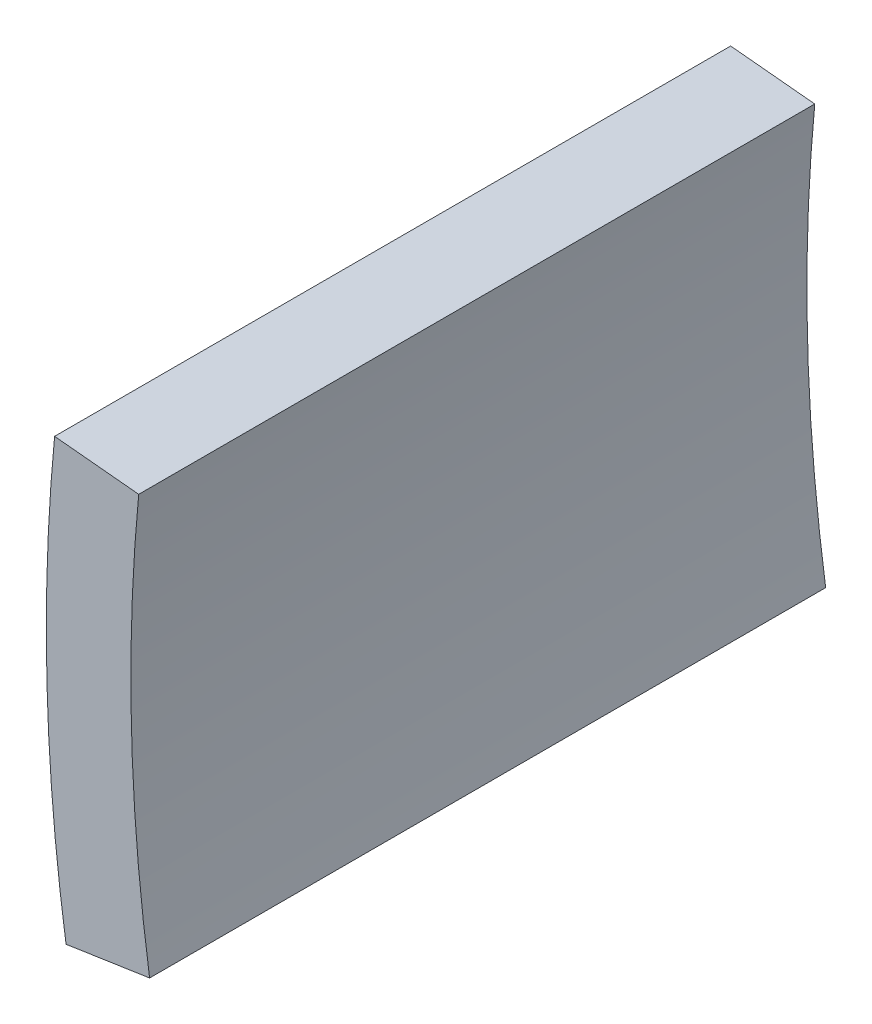
ISO-10303-21;
HEADER;
FILE_DESCRIPTION(('STEP AP214'),'2;1');
FILE_NAME('part.step','',(''),(''),'','','');
FILE_SCHEMA(('AUTOMOTIVE_DESIGN { 1 0 10303 214 1 1 1 1 }'));
ENDSEC;
DATA;
#1=APPLICATION_CONTEXT('core data for automotive mechanical design processes');
#2=APPLICATION_PROTOCOL_DEFINITION('international standard','automotive_design',2000,#1);
#3=PRODUCT_CONTEXT('',#1,'mechanical');
#4=PRODUCT('Part','Part','',(#3));
#5=PRODUCT_RELATED_PRODUCT_CATEGORY('part','',(#4));
#6=PRODUCT_DEFINITION_FORMATION('','',#4);
#7=PRODUCT_DEFINITION_CONTEXT('part definition',#1,'design');
#8=PRODUCT_DEFINITION('design','',#6,#7);
#9=PRODUCT_DEFINITION_SHAPE('','',#8);
#10=(LENGTH_UNIT() NAMED_UNIT(*) SI_UNIT(.MILLI.,.METRE.));
#11=(NAMED_UNIT(*) PLANE_ANGLE_UNIT() SI_UNIT($,.RADIAN.));
#12=(NAMED_UNIT(*) SI_UNIT($,.STERADIAN.) SOLID_ANGLE_UNIT());
#13=UNCERTAINTY_MEASURE_WITH_UNIT(LENGTH_MEASURE(1.E-05),#10,'distance_accuracy_value','');
#14=(GEOMETRIC_REPRESENTATION_CONTEXT(3) GLOBAL_UNCERTAINTY_ASSIGNED_CONTEXT((#13)) GLOBAL_UNIT_ASSIGNED_CONTEXT((#10,
#11,#12)) REPRESENTATION_CONTEXT('',''));
#15=CARTESIAN_POINT('',(0.,0.,0.));
#16=DIRECTION('',(0.,0.,1.));
#17=DIRECTION('',(1.,0.,0.));
#18=AXIS2_PLACEMENT_3D('',#15,#16,#17);
#19=CARTESIAN_POINT('',(-57.0693658112593,8.40028961738728,10.));
#20=DIRECTION('',(-0.148817900233571,0.988864617917979,0.));
#21=DIRECTION('',(0.,0.,1.));
#22=AXIS2_PLACEMENT_3D('',#19,#20,#21);
#23=PLANE('',#22);
#24=DIRECTION('',(0.988864617917979,0.148817900233571,0.));
#25=VECTOR('',#24,1.);
#26=CARTESIAN_POINT('',(-57.0693658112593,8.40028961738728,-18.));
#27=LINE('',#26,#25);
#28=CARTESIAN_POINT('',(-159.883715157092,-7.07262275735473,-18.));
#29=VERTEX_POINT('',#28);
#30=CARTESIAN_POINT('',(-155.68104053091,-6.44014668135742,-18.));
#31=VERTEX_POINT('',#30);
#32=EDGE_CURVE('E11',#29,#31,#27,.T.);
#33=ORIENTED_EDGE('',*,*,#32,.T.);
#34=DIRECTION('',(0.,0.,-1.));
#35=VECTOR('',#34,1.);
#36=CARTESIAN_POINT('',(-155.68104053091,-6.44014668135742,10.));
#37=LINE('',#36,#35);
#38=CARTESIAN_POINT('',(-155.68104053091,-6.44014668135742,16.));
#39=VERTEX_POINT('',#38);
#40=EDGE_CURVE('E35',#39,#31,#37,.T.);
#41=ORIENTED_EDGE('',*,*,#40,.F.);
#42=DIRECTION('',(0.988864617917979,0.148817900233571,0.));
#43=VECTOR('',#42,1.);
#44=CARTESIAN_POINT('',(-57.0693658112593,8.40028961738728,16.));
#45=LINE('',#44,#43);
#46=CARTESIAN_POINT('',(-159.883715157092,-7.07262275735473,16.));
#47=VERTEX_POINT('',#46);
#48=EDGE_CURVE('E43',#47,#39,#45,.T.);
#49=ORIENTED_EDGE('',*,*,#48,.F.);
#50=DIRECTION('',(0.,0.,-1.));
#51=VECTOR('',#50,1.);
#52=CARTESIAN_POINT('',(-159.883715157092,-7.07262275735473,10.));
#53=LINE('',#52,#51);
#54=EDGE_CURVE('E27',#47,#29,#53,.T.);
#55=ORIENTED_EDGE('',*,*,#54,.T.);
#56=EDGE_LOOP('',(#33,#41,#49,#55));
#57=FACE_BOUND('',#56,.T.);
#58=ADVANCED_FACE('F17',(#57),#23,.F.);
#59=CARTESIAN_POINT('',(-71.8747641621128,6.17217036174182,10.));
#60=DIRECTION('',(0.,0.,-1.));
#61=DIRECTION('',(-1.,0.,0.));
#62=AXIS2_PLACEMENT_3D('',#59,#60,#61);
#63=CYLINDRICAL_SURFACE('',#62,89.0000000000243);
#64=CARTESIAN_POINT('',(-71.8747641621128,6.17217036174182,16.));
#65=DIRECTION('',(0.,0.,1.));
#66=DIRECTION('',(-1.,0.,0.));
#67=AXIS2_PLACEMENT_3D('',#64,#65,#66);
#68=CIRCLE('',#67,89.0000000000243);
#69=CARTESIAN_POINT('',(-160.459187157214,14.7628631527419,16.));
#70=VERTEX_POINT('',#69);
#71=EDGE_CURVE('E88',#70,#47,#68,.T.);
#72=ORIENTED_EDGE('',*,*,#71,.F.);
#73=DIRECTION('',(0.,0.,-1.));
#74=VECTOR('',#73,1.);
#75=CARTESIAN_POINT('',(-160.459187157214,14.7628631527419,10.));
#76=LINE('',#75,#74);
#77=CARTESIAN_POINT('',(-160.459187157214,14.7628631527419,-18.));
#78=VERTEX_POINT('',#77);
#79=EDGE_CURVE('E65',#70,#78,#76,.T.);
#80=ORIENTED_EDGE('',*,*,#79,.T.);
#81=CARTESIAN_POINT('',(-71.8747641621128,6.17217036174182,-18.));
#82=DIRECTION('',(0.,0.,1.));
#83=DIRECTION('',(-1.,0.,0.));
#84=AXIS2_PLACEMENT_3D('',#81,#82,#83);
#85=CIRCLE('',#84,89.0000000000243);
#86=EDGE_CURVE('E71',#78,#29,#85,.T.);
#87=ORIENTED_EDGE('',*,*,#86,.T.);
#88=ORIENTED_EDGE('',*,*,#54,.F.);
#89=EDGE_LOOP('',(#72,#80,#87,#88));
#90=FACE_BOUND('',#89,.T.);
#91=ADVANCED_FACE('F74',(#90),#63,.T.);
#92=CARTESIAN_POINT('',(-48.8921667655877,3.94337632527594,10.));
#93=DIRECTION('',(-0.0965246380933628,-0.995330595451052,0.));
#94=DIRECTION('',(-0.995330595451052,0.0965246380933628,0.));
#95=AXIS2_PLACEMENT_3D('',#92,#93,#94);
#96=PLANE('',#95);
#97=DIRECTION('',(-0.995330595451052,0.0965246380933628,0.));
#98=VECTOR('',#97,1.);
#99=CARTESIAN_POINT('',(-48.8921667655877,3.94337632527594,-18.));
#100=LINE('',#99,#98);
#101=CARTESIAN_POINT('',(-156.229032126516,14.3526334408421,-18.));
#102=VERTEX_POINT('',#101);
#103=EDGE_CURVE('E21',#102,#78,#100,.T.);
#104=ORIENTED_EDGE('',*,*,#103,.T.);
#105=ORIENTED_EDGE('',*,*,#79,.F.);
#106=DIRECTION('',(-0.995330595451052,0.0965246380933628,0.));
#107=VECTOR('',#106,1.);
#108=CARTESIAN_POINT('',(-48.8921667655877,3.94337632527594,16.));
#109=LINE('',#108,#107);
#110=CARTESIAN_POINT('',(-156.229032126516,14.3526334408421,16.));
#111=VERTEX_POINT('',#110);
#112=EDGE_CURVE('E93',#111,#70,#109,.T.);
#113=ORIENTED_EDGE('',*,*,#112,.F.);
#114=DIRECTION('',(0.,0.,-1.));
#115=VECTOR('',#114,1.);
#116=CARTESIAN_POINT('',(-156.229032126516,14.3526334408421,10.));
#117=LINE('',#116,#115);
#118=EDGE_CURVE('E85',#111,#102,#117,.T.);
#119=ORIENTED_EDGE('',*,*,#118,.T.);
#120=EDGE_LOOP('',(#104,#105,#113,#119));
#121=FACE_BOUND('',#120,.T.);
#122=ADVANCED_FACE('F112',(#121),#96,.F.);
#123=CARTESIAN_POINT('',(-71.8747641621128,6.17217036174182,10.));
#124=DIRECTION('',(0.,0.,-1.));
#125=DIRECTION('',(-1.,0.,0.));
#126=AXIS2_PLACEMENT_3D('',#123,#124,#125);
#127=CYLINDRICAL_SURFACE('',#126,84.7499999999932);
#128=CARTESIAN_POINT('',(-71.8747641621128,6.17217036174182,16.));
#129=DIRECTION('',(0.,0.,1.));
#130=DIRECTION('',(-1.,0.,0.));
#131=AXIS2_PLACEMENT_3D('',#128,#129,#130);
#132=CIRCLE('',#131,84.7499999999932);
#133=EDGE_CURVE('E99',#111,#39,#132,.T.);
#134=ORIENTED_EDGE('',*,*,#133,.T.);
#135=ORIENTED_EDGE('',*,*,#40,.T.);
#136=CARTESIAN_POINT('',(-71.8747641621128,6.17217036174182,-18.));
#137=DIRECTION('',(0.,0.,1.));
#138=DIRECTION('',(-1.,0.,0.));
#139=AXIS2_PLACEMENT_3D('',#136,#137,#138);
#140=CIRCLE('',#139,84.7499999999932);
#141=EDGE_CURVE('E73',#102,#31,#140,.T.);
#142=ORIENTED_EDGE('',*,*,#141,.F.);
#143=ORIENTED_EDGE('',*,*,#118,.F.);
#144=EDGE_LOOP('',(#134,#135,#142,#143));
#145=FACE_BOUND('',#144,.T.);
#146=ADVANCED_FACE('F19',(#145),#127,.F.);
#147=CARTESIAN_POINT('',(-51.833752333337,-26.38929492376,16.));
#148=DIRECTION('',(0.,0.,1.));
#149=DIRECTION('',(1.,0.,0.));
#150=AXIS2_PLACEMENT_3D('',#147,#148,#149);
#151=PLANE('',#150);
#152=ORIENTED_EDGE('',*,*,#133,.F.);
#153=ORIENTED_EDGE('',*,*,#112,.T.);
#154=ORIENTED_EDGE('',*,*,#71,.T.);
#155=ORIENTED_EDGE('',*,*,#48,.T.);
#156=EDGE_LOOP('',(#152,#153,#154,#155));
#157=FACE_BOUND('',#156,.T.);
#158=ADVANCED_FACE('F109',(#157),#151,.T.);
#159=CARTESIAN_POINT('',(-51.833752333337,-26.38929492376,-18.));
#160=DIRECTION('',(0.,0.,1.));
#161=DIRECTION('',(1.,0.,0.));
#162=AXIS2_PLACEMENT_3D('',#159,#160,#161);
#163=PLANE('',#162);
#164=ORIENTED_EDGE('',*,*,#141,.T.);
#165=ORIENTED_EDGE('',*,*,#32,.F.);
#166=ORIENTED_EDGE('',*,*,#86,.F.);
#167=ORIENTED_EDGE('',*,*,#103,.F.);
#168=EDGE_LOOP('',(#164,#165,#166,#167));
#169=FACE_BOUND('',#168,.T.);
#170=ADVANCED_FACE('F69',(#169),#163,.F.);
#171=CLOSED_SHELL('',(#58,#91,#122,#146,#158,#170));
#172=MANIFOLD_SOLID_BREP('B1',#171);
#173=ADVANCED_BREP_SHAPE_REPRESENTATION('',(#18,#172),#14);
#174=SHAPE_DEFINITION_REPRESENTATION(#9,#173);
ENDSEC;
END-ISO-10303-21;
